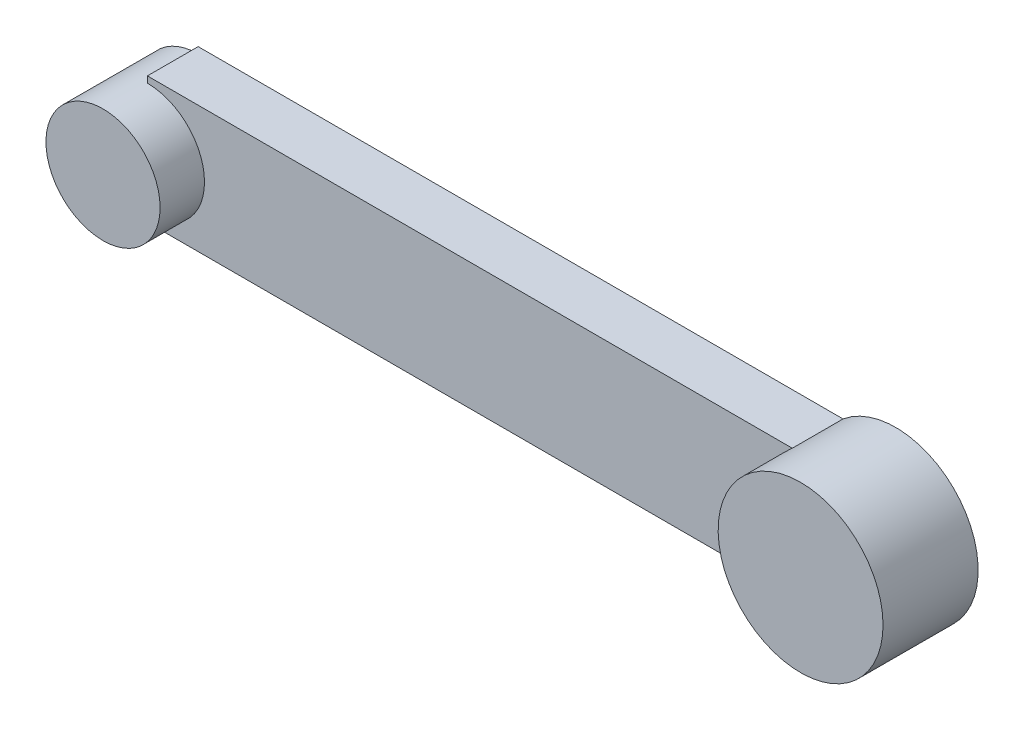
ISO-10303-21;
HEADER;
FILE_DESCRIPTION(('STEP AP214'),'2;1');
FILE_NAME('part.step','',(''),(''),'','','');
FILE_SCHEMA(('AUTOMOTIVE_DESIGN { 1 0 10303 214 1 1 1 1 }'));
ENDSEC;
DATA;
#1=APPLICATION_CONTEXT('core data for automotive mechanical design processes');
#2=APPLICATION_PROTOCOL_DEFINITION('international standard','automotive_design',2000,#1);
#3=PRODUCT_CONTEXT('',#1,'mechanical');
#4=PRODUCT('Part','Part','',(#3));
#5=PRODUCT_RELATED_PRODUCT_CATEGORY('part','',(#4));
#6=PRODUCT_DEFINITION_FORMATION('','',#4);
#7=PRODUCT_DEFINITION_CONTEXT('part definition',#1,'design');
#8=PRODUCT_DEFINITION('design','',#6,#7);
#9=PRODUCT_DEFINITION_SHAPE('','',#8);
#10=(LENGTH_UNIT() NAMED_UNIT(*) SI_UNIT(.MILLI.,.METRE.));
#11=(NAMED_UNIT(*) PLANE_ANGLE_UNIT() SI_UNIT($,.RADIAN.));
#12=(NAMED_UNIT(*) SI_UNIT($,.STERADIAN.) SOLID_ANGLE_UNIT());
#13=UNCERTAINTY_MEASURE_WITH_UNIT(LENGTH_MEASURE(1.E-05),#10,'distance_accuracy_value','');
#14=(GEOMETRIC_REPRESENTATION_CONTEXT(3) GLOBAL_UNCERTAINTY_ASSIGNED_CONTEXT((#13)) GLOBAL_UNIT_ASSIGNED_CONTEXT((#10,
#11,#12)) REPRESENTATION_CONTEXT('',''));
#15=CARTESIAN_POINT('',(0.,0.,0.));
#16=DIRECTION('',(0.,0.,1.));
#17=DIRECTION('',(1.,0.,0.));
#18=AXIS2_PLACEMENT_3D('',#15,#16,#17);
#19=CARTESIAN_POINT('',(0.,105000.,8000.));
#20=DIRECTION('',(0.,1.,0.));
#21=DIRECTION('',(0.,0.,1.));
#22=AXIS2_PLACEMENT_3D('',#19,#20,#21);
#23=PLANE('',#22);
#24=DIRECTION('',(0.,0.,-1.));
#25=VECTOR('',#24,1.);
#26=CARTESIAN_POINT('',(101693.376137082,105000.,15000.));
#27=LINE('',#26,#25);
#28=CARTESIAN_POINT('',(101693.376137082,105000.,8000.));
#29=VERTEX_POINT('',#28);
#30=CARTESIAN_POINT('',(101693.376137082,105000.,0.));
#31=VERTEX_POINT('',#30);
#32=EDGE_CURVE('E110',#29,#31,#27,.T.);
#33=ORIENTED_EDGE('',*,*,#32,.F.);
#34=DIRECTION('',(1.,0.,0.));
#35=VECTOR('',#34,1.);
#36=CARTESIAN_POINT('',(0.,105000.,8000.));
#37=LINE('',#36,#35);
#38=CARTESIAN_POINT('',(0.,105000.,8000.));
#39=VERTEX_POINT('',#38);
#40=EDGE_CURVE('E98',#39,#29,#37,.T.);
#41=ORIENTED_EDGE('',*,*,#40,.F.);
#42=DIRECTION('',(0.,0.,-1.));
#43=VECTOR('',#42,1.);
#44=CARTESIAN_POINT('',(0.,105000.,8000.));
#45=LINE('',#44,#43);
#46=CARTESIAN_POINT('',(0.,105000.,0.));
#47=VERTEX_POINT('',#46);
#48=EDGE_CURVE('E11',#39,#47,#45,.T.);
#49=ORIENTED_EDGE('',*,*,#48,.T.);
#50=DIRECTION('',(1.,0.,0.));
#51=VECTOR('',#50,1.);
#52=CARTESIAN_POINT('',(0.,105000.,0.));
#53=LINE('',#52,#51);
#54=EDGE_CURVE('E67',#47,#31,#53,.T.);
#55=ORIENTED_EDGE('',*,*,#54,.T.);
#56=EDGE_LOOP('',(#33,#41,#49,#55));
#57=FACE_BOUND('',#56,.T.);
#58=ADVANCED_FACE('F44',(#57),#23,.F.);
#59=CARTESIAN_POINT('',(0.,125000.,8000.));
#60=DIRECTION('',(0.,-1.,0.));
#61=DIRECTION('',(0.,0.,-1.));
#62=AXIS2_PLACEMENT_3D('',#59,#60,#61);
#63=PLANE('',#62);
#64=DIRECTION('',(0.,0.,-1.));
#65=VECTOR('',#64,1.);
#66=CARTESIAN_POINT('',(101693.376137082,125000.,15000.));
#67=LINE('',#66,#65);
#68=CARTESIAN_POINT('',(101693.376137082,125000.,0.));
#69=VERTEX_POINT('',#68);
#70=CARTESIAN_POINT('',(101693.376137082,125000.,8000.));
#71=VERTEX_POINT('',#70);
#72=EDGE_CURVE('E114',#69,#71,#67,.F.);
#73=ORIENTED_EDGE('',*,*,#72,.F.);
#74=DIRECTION('',(-1.,0.,0.));
#75=VECTOR('',#74,1.);
#76=CARTESIAN_POINT('',(0.,125000.,0.));
#77=LINE('',#76,#75);
#78=CARTESIAN_POINT('',(0.,125000.,0.));
#79=VERTEX_POINT('',#78);
#80=EDGE_CURVE('E160',#69,#79,#77,.T.);
#81=ORIENTED_EDGE('',*,*,#80,.T.);
#82=DIRECTION('',(0.,0.,-1.));
#83=VECTOR('',#82,1.);
#84=CARTESIAN_POINT('',(0.,125000.,8000.));
#85=LINE('',#84,#83);
#86=CARTESIAN_POINT('',(0.,125000.,8000.));
#87=VERTEX_POINT('',#86);
#88=EDGE_CURVE('E53',#87,#79,#85,.T.);
#89=ORIENTED_EDGE('',*,*,#88,.F.);
#90=DIRECTION('',(-1.,0.,0.));
#91=VECTOR('',#90,1.);
#92=CARTESIAN_POINT('',(0.,125000.,8000.));
#93=LINE('',#92,#91);
#94=EDGE_CURVE('E102',#71,#87,#93,.T.);
#95=ORIENTED_EDGE('',*,*,#94,.F.);
#96=EDGE_LOOP('',(#73,#81,#89,#95));
#97=FACE_BOUND('',#96,.T.);
#98=ADVANCED_FACE('F179',(#97),#63,.F.);
#99=CARTESIAN_POINT('',(0.,105000.,8000.));
#100=DIRECTION('',(1.,0.,0.));
#101=DIRECTION('',(0.,0.,-1.));
#102=AXIS2_PLACEMENT_3D('',#99,#100,#101);
#103=PLANE('',#102);
#104=DIRECTION('',(0.,0.,-1.));
#105=VECTOR('',#104,1.);
#106=CARTESIAN_POINT('',(0.,106000.,15000.));
#107=LINE('',#106,#105);
#108=CARTESIAN_POINT('',(0.,106000.,0.));
#109=VERTEX_POINT('',#108);
#110=CARTESIAN_POINT('',(0.,106000.,8000.));
#111=VERTEX_POINT('',#110);
#112=EDGE_CURVE('E141',#109,#111,#107,.F.);
#113=ORIENTED_EDGE('',*,*,#112,.F.);
#114=DIRECTION('',(0.,-1.,0.));
#115=VECTOR('',#114,1.);
#116=CARTESIAN_POINT('',(0.,105000.,0.));
#117=LINE('',#116,#115);
#118=EDGE_CURVE('E150',#109,#47,#117,.T.);
#119=ORIENTED_EDGE('',*,*,#118,.T.);
#120=ORIENTED_EDGE('',*,*,#48,.F.);
#121=DIRECTION('',(0.,-1.,0.));
#122=VECTOR('',#121,1.);
#123=CARTESIAN_POINT('',(0.,105000.,8000.));
#124=LINE('',#123,#122);
#125=EDGE_CURVE('E101',#111,#39,#124,.T.);
#126=ORIENTED_EDGE('',*,*,#125,.F.);
#127=EDGE_LOOP('',(#113,#119,#120,#126));
#128=FACE_BOUND('',#127,.T.);
#129=ADVANCED_FACE('F50',(#128),#103,.F.);
#130=DIRECTION('',(0.,0.,-1.));
#131=VECTOR('',#130,1.);
#132=CARTESIAN_POINT('',(0.,124000.,15000.));
#133=LINE('',#132,#131);
#134=CARTESIAN_POINT('',(0.,124000.,8000.));
#135=VERTEX_POINT('',#134);
#136=CARTESIAN_POINT('',(0.,124000.,0.));
#137=VERTEX_POINT('',#136);
#138=EDGE_CURVE('E138',#135,#137,#133,.T.);
#139=ORIENTED_EDGE('',*,*,#138,.F.);
#140=EDGE_CURVE('E104',#87,#135,#124,.T.);
#141=ORIENTED_EDGE('',*,*,#140,.F.);
#142=ORIENTED_EDGE('',*,*,#88,.T.);
#143=EDGE_CURVE('E155',#79,#137,#117,.T.);
#144=ORIENTED_EDGE('',*,*,#143,.T.);
#145=EDGE_LOOP('',(#139,#141,#142,#144));
#146=FACE_BOUND('',#145,.T.);
#147=ADVANCED_FACE('F167',(#146),#103,.F.);
#148=CARTESIAN_POINT('',(0.,0.,8000.));
#149=DIRECTION('',(0.,0.,-1.));
#150=DIRECTION('',(-1.,0.,0.));
#151=AXIS2_PLACEMENT_3D('',#148,#149,#150);
#152=PLANE('',#151);
#153=CARTESIAN_POINT('',(110000.,115000.,8000.));
#154=DIRECTION('',(0.,0.,-1.));
#155=DIRECTION('',(-1.,0.,0.));
#156=AXIS2_PLACEMENT_3D('',#153,#154,#155);
#157=CIRCLE('',#156,13000.);
#158=EDGE_CURVE('E63',#71,#29,#157,.F.);
#159=ORIENTED_EDGE('',*,*,#158,.F.);
#160=ORIENTED_EDGE('',*,*,#94,.T.);
#161=ORIENTED_EDGE('',*,*,#140,.T.);
#162=CARTESIAN_POINT('',(0.,115000.,8000.));
#163=DIRECTION('',(0.,0.,-1.));
#164=DIRECTION('',(-1.,0.,0.));
#165=AXIS2_PLACEMENT_3D('',#162,#163,#164);
#166=CIRCLE('',#165,9000.);
#167=EDGE_CURVE('E134',#111,#135,#166,.F.);
#168=ORIENTED_EDGE('',*,*,#167,.F.);
#169=ORIENTED_EDGE('',*,*,#125,.T.);
#170=ORIENTED_EDGE('',*,*,#40,.T.);
#171=EDGE_LOOP('',(#159,#160,#161,#168,#169,#170));
#172=FACE_BOUND('',#171,.T.);
#173=ADVANCED_FACE('F97',(#172),#152,.F.);
#174=CARTESIAN_POINT('',(0.,0.,0.));
#175=DIRECTION('',(0.,0.,-1.));
#176=DIRECTION('',(-1.,0.,0.));
#177=AXIS2_PLACEMENT_3D('',#174,#175,#176);
#178=PLANE('',#177);
#179=ORIENTED_EDGE('',*,*,#80,.F.);
#180=CARTESIAN_POINT('',(110000.,115000.,0.));
#181=DIRECTION('',(0.,0.,1.));
#182=DIRECTION('',(1.,0.,0.));
#183=AXIS2_PLACEMENT_3D('',#180,#181,#182);
#184=CIRCLE('',#183,13000.);
#185=EDGE_CURVE('E123',#31,#69,#184,.T.);
#186=ORIENTED_EDGE('',*,*,#185,.F.);
#187=ORIENTED_EDGE('',*,*,#54,.F.);
#188=ORIENTED_EDGE('',*,*,#118,.F.);
#189=CARTESIAN_POINT('',(0.,115000.,0.));
#190=DIRECTION('',(0.,0.,1.));
#191=DIRECTION('',(1.,0.,0.));
#192=AXIS2_PLACEMENT_3D('',#189,#190,#191);
#193=CIRCLE('',#192,9000.);
#194=EDGE_CURVE('E115',#137,#109,#193,.T.);
#195=ORIENTED_EDGE('',*,*,#194,.F.);
#196=ORIENTED_EDGE('',*,*,#143,.F.);
#197=EDGE_LOOP('',(#179,#186,#187,#188,#195,#196));
#198=FACE_BOUND('',#197,.T.);
#199=ADVANCED_FACE('F173',(#198),#178,.T.);
#200=CARTESIAN_POINT('',(0.,115000.,15000.));
#201=DIRECTION('',(0.,0.,-1.));
#202=DIRECTION('',(-1.,0.,0.));
#203=AXIS2_PLACEMENT_3D('',#200,#201,#202);
#204=CYLINDRICAL_SURFACE('',#203,9000.);
#205=CARTESIAN_POINT('',(0.,115000.,15000.));
#206=DIRECTION('',(0.,0.,1.));
#207=DIRECTION('',(1.,0.,0.));
#208=AXIS2_PLACEMENT_3D('',#205,#206,#207);
#209=CIRCLE('',#208,9000.);
#210=CARTESIAN_POINT('',(9000.,115000.,15000.));
#211=VERTEX_POINT('',#210);
#212=EDGE_CURVE('E126',#211,#211,#209,.T.);
#213=ORIENTED_EDGE('',*,*,#212,.F.);
#214=EDGE_LOOP('',(#213));
#215=FACE_BOUND('',#214,.T.);
#216=ORIENTED_EDGE('',*,*,#194,.T.);
#217=ORIENTED_EDGE('',*,*,#112,.T.);
#218=ORIENTED_EDGE('',*,*,#167,.T.);
#219=ORIENTED_EDGE('',*,*,#138,.T.);
#220=EDGE_LOOP('',(#216,#217,#218,#219));
#221=FACE_BOUND('',#220,.T.);
#222=ADVANCED_FACE('F175',(#215,#221),#204,.T.);
#223=CARTESIAN_POINT('',(0.,115000.,15000.));
#224=DIRECTION('',(0.,0.,1.));
#225=DIRECTION('',(1.,0.,0.));
#226=AXIS2_PLACEMENT_3D('',#223,#224,#225);
#227=PLANE('',#226);
#228=ORIENTED_EDGE('',*,*,#212,.T.);
#229=EDGE_LOOP('',(#228));
#230=FACE_BOUND('',#229,.T.);
#231=ADVANCED_FACE('F197',(#230),#227,.T.);
#232=CARTESIAN_POINT('',(110000.,115000.,15000.));
#233=DIRECTION('',(0.,0.,-1.));
#234=DIRECTION('',(-1.,0.,0.));
#235=AXIS2_PLACEMENT_3D('',#232,#233,#234);
#236=CYLINDRICAL_SURFACE('',#235,13000.);
#237=CARTESIAN_POINT('',(110000.,115000.,15000.));
#238=DIRECTION('',(0.,0.,1.));
#239=DIRECTION('',(1.,0.,0.));
#240=AXIS2_PLACEMENT_3D('',#237,#238,#239);
#241=CIRCLE('',#240,13000.);
#242=CARTESIAN_POINT('',(123000.,115000.,15000.));
#243=VERTEX_POINT('',#242);
#244=EDGE_CURVE('E117',#243,#243,#241,.T.);
#245=ORIENTED_EDGE('',*,*,#244,.F.);
#246=EDGE_LOOP('',(#245));
#247=FACE_BOUND('',#246,.T.);
#248=ORIENTED_EDGE('',*,*,#158,.T.);
#249=ORIENTED_EDGE('',*,*,#32,.T.);
#250=ORIENTED_EDGE('',*,*,#185,.T.);
#251=ORIENTED_EDGE('',*,*,#72,.T.);
#252=EDGE_LOOP('',(#248,#249,#250,#251));
#253=FACE_BOUND('',#252,.T.);
#254=ADVANCED_FACE('F118',(#247,#253),#236,.T.);
#255=CARTESIAN_POINT('',(110000.,115000.,15000.));
#256=DIRECTION('',(0.,0.,1.));
#257=DIRECTION('',(1.,0.,0.));
#258=AXIS2_PLACEMENT_3D('',#255,#256,#257);
#259=PLANE('',#258);
#260=ORIENTED_EDGE('',*,*,#244,.T.);
#261=EDGE_LOOP('',(#260));
#262=FACE_BOUND('',#261,.T.);
#263=ADVANCED_FACE('F201',(#262),#259,.T.);
#264=CLOSED_SHELL('',(#58,#98,#129,#147,#173,#199,#222,#231,#254,#263));
#265=MANIFOLD_SOLID_BREP('B2',#264);
#266=ADVANCED_BREP_SHAPE_REPRESENTATION('',(#18,#265),#14);
#267=SHAPE_DEFINITION_REPRESENTATION(#9,#266);
ENDSEC;
END-ISO-10303-21;
